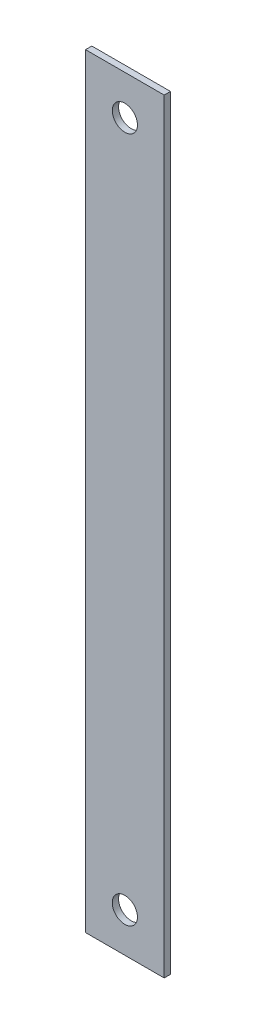
ISO-10303-21;
HEADER;
FILE_DESCRIPTION(('STEP AP214'),'2;1');
FILE_NAME('part.step','',(''),(''),'','','');
FILE_SCHEMA(('AUTOMOTIVE_DESIGN { 1 0 10303 214 1 1 1 1 }'));
ENDSEC;
DATA;
#1=APPLICATION_CONTEXT('core data for automotive mechanical design processes');
#2=APPLICATION_PROTOCOL_DEFINITION('international standard','automotive_design',2000,#1);
#3=PRODUCT_CONTEXT('',#1,'mechanical');
#4=PRODUCT('Part','Part','',(#3));
#5=PRODUCT_RELATED_PRODUCT_CATEGORY('part','',(#4));
#6=PRODUCT_DEFINITION_FORMATION('','',#4);
#7=PRODUCT_DEFINITION_CONTEXT('part definition',#1,'design');
#8=PRODUCT_DEFINITION('design','',#6,#7);
#9=PRODUCT_DEFINITION_SHAPE('','',#8);
#10=(LENGTH_UNIT() NAMED_UNIT(*) SI_UNIT(.MILLI.,.METRE.));
#11=(NAMED_UNIT(*) PLANE_ANGLE_UNIT() SI_UNIT($,.RADIAN.));
#12=(NAMED_UNIT(*) SI_UNIT($,.STERADIAN.) SOLID_ANGLE_UNIT());
#13=UNCERTAINTY_MEASURE_WITH_UNIT(LENGTH_MEASURE(1.E-05),#10,'distance_accuracy_value','');
#14=(GEOMETRIC_REPRESENTATION_CONTEXT(3) GLOBAL_UNCERTAINTY_ASSIGNED_CONTEXT((#13)) GLOBAL_UNIT_ASSIGNED_CONTEXT((#10,
#11,#12)) REPRESENTATION_CONTEXT('',''));
#15=CARTESIAN_POINT('',(0.,0.,0.));
#16=DIRECTION('',(0.,0.,1.));
#17=DIRECTION('',(1.,0.,0.));
#18=AXIS2_PLACEMENT_3D('',#15,#16,#17);
#19=CARTESIAN_POINT('',(0.,0.,2.));
#20=DIRECTION('',(0.,0.,1.));
#21=DIRECTION('',(1.,0.,0.));
#22=AXIS2_PLACEMENT_3D('',#19,#20,#21);
#23=PLANE('',#22);
#24=CARTESIAN_POINT('',(0.,109.,2.));
#25=DIRECTION('',(0.,0.,1.));
#26=DIRECTION('',(1.,0.,0.));
#27=AXIS2_PLACEMENT_3D('',#24,#25,#26);
#28=CIRCLE('',#27,4.);
#29=CARTESIAN_POINT('',(4.,109.,2.));
#30=VERTEX_POINT('',#29);
#31=EDGE_CURVE('E100',#30,#30,#28,.T.);
#32=ORIENTED_EDGE('',*,*,#31,.F.);
#33=EDGE_LOOP('',(#32));
#34=FACE_BOUND('',#33,.T.);
#35=DIRECTION('',(0.,1.,0.));
#36=VECTOR('',#35,1.);
#37=CARTESIAN_POINT('',(12.5,121.5,2.));
#38=LINE('',#37,#36);
#39=CARTESIAN_POINT('',(12.5,-121.5,2.));
#40=VERTEX_POINT('',#39);
#41=CARTESIAN_POINT('',(12.5,121.5,2.));
#42=VERTEX_POINT('',#41);
#43=EDGE_CURVE('E82',#40,#42,#38,.T.);
#44=ORIENTED_EDGE('',*,*,#43,.T.);
#45=DIRECTION('',(-1.,0.,0.));
#46=VECTOR('',#45,1.);
#47=CARTESIAN_POINT('',(3.5000000000001,121.5,2.));
#48=LINE('',#47,#46);
#49=CARTESIAN_POINT('',(-12.5,121.5,2.));
#50=VERTEX_POINT('',#49);
#51=EDGE_CURVE('E76',#42,#50,#48,.T.);
#52=ORIENTED_EDGE('',*,*,#51,.T.);
#53=DIRECTION('',(-1.64423508113657E-12,-1.,0.));
#54=VECTOR('',#53,1.);
#55=CARTESIAN_POINT('',(-12.5,121.482064426535,2.));
#56=LINE('',#55,#54);
#57=CARTESIAN_POINT('',(-12.5,-121.5,2.));
#58=VERTEX_POINT('',#57);
#59=EDGE_CURVE('E79',#50,#58,#56,.T.);
#60=ORIENTED_EDGE('',*,*,#59,.T.);
#61=DIRECTION('',(1.,0.,0.));
#62=VECTOR('',#61,1.);
#63=CARTESIAN_POINT('',(-12.5,-121.5,2.));
#64=LINE('',#63,#62);
#65=EDGE_CURVE('E49',#58,#40,#64,.T.);
#66=ORIENTED_EDGE('',*,*,#65,.T.);
#67=EDGE_LOOP('',(#44,#52,#60,#66));
#68=FACE_BOUND('',#67,.T.);
#69=CARTESIAN_POINT('',(0.,-109.,2.));
#70=DIRECTION('',(0.,0.,1.));
#71=DIRECTION('',(-1.,0.,0.));
#72=AXIS2_PLACEMENT_3D('',#69,#70,#71);
#73=CIRCLE('',#72,4.);
#74=CARTESIAN_POINT('',(-4.,-109.,2.));
#75=VERTEX_POINT('',#74);
#76=EDGE_CURVE('E112',#75,#75,#73,.T.);
#77=ORIENTED_EDGE('',*,*,#76,.F.);
#78=EDGE_LOOP('',(#77));
#79=FACE_BOUND('',#78,.T.);
#80=ADVANCED_FACE('F32',(#34,#68,#79),#23,.T.);
#81=CARTESIAN_POINT('',(0.,0.,0.));
#82=DIRECTION('',(0.,0.,1.));
#83=DIRECTION('',(1.,0.,0.));
#84=AXIS2_PLACEMENT_3D('',#81,#82,#83);
#85=PLANE('',#84);
#86=DIRECTION('',(0.,1.,0.));
#87=VECTOR('',#86,1.);
#88=CARTESIAN_POINT('',(12.5,121.5,0.));
#89=LINE('',#88,#87);
#90=CARTESIAN_POINT('',(12.5,-121.5,0.));
#91=VERTEX_POINT('',#90);
#92=CARTESIAN_POINT('',(12.5,121.5,0.));
#93=VERTEX_POINT('',#92);
#94=EDGE_CURVE('E97',#91,#93,#89,.T.);
#95=ORIENTED_EDGE('',*,*,#94,.F.);
#96=DIRECTION('',(1.,0.,0.));
#97=VECTOR('',#96,1.);
#98=CARTESIAN_POINT('',(3.50000000000013,-121.5,0.));
#99=LINE('',#98,#97);
#100=CARTESIAN_POINT('',(-12.5,-121.5,0.));
#101=VERTEX_POINT('',#100);
#102=EDGE_CURVE('E65',#101,#91,#99,.T.);
#103=ORIENTED_EDGE('',*,*,#102,.F.);
#104=DIRECTION('',(0.,-1.,0.));
#105=VECTOR('',#104,1.);
#106=CARTESIAN_POINT('',(-12.5,-115.487492177719,0.));
#107=LINE('',#106,#105);
#108=CARTESIAN_POINT('',(-12.5,121.5,0.));
#109=VERTEX_POINT('',#108);
#110=EDGE_CURVE('E102',#109,#101,#107,.T.);
#111=ORIENTED_EDGE('',*,*,#110,.F.);
#112=DIRECTION('',(-1.,0.,0.));
#113=VECTOR('',#112,1.);
#114=CARTESIAN_POINT('',(-12.5,121.5,0.));
#115=LINE('',#114,#113);
#116=EDGE_CURVE('E88',#93,#109,#115,.T.);
#117=ORIENTED_EDGE('',*,*,#116,.F.);
#118=EDGE_LOOP('',(#95,#103,#111,#117));
#119=FACE_BOUND('',#118,.T.);
#120=CARTESIAN_POINT('',(0.,109.,0.));
#121=DIRECTION('',(0.,0.,1.));
#122=DIRECTION('',(1.,0.,0.));
#123=AXIS2_PLACEMENT_3D('',#120,#121,#122);
#124=CIRCLE('',#123,4.);
#125=CARTESIAN_POINT('',(4.,109.,0.));
#126=VERTEX_POINT('',#125);
#127=EDGE_CURVE('E109',#126,#126,#124,.T.);
#128=ORIENTED_EDGE('',*,*,#127,.T.);
#129=EDGE_LOOP('',(#128));
#130=FACE_BOUND('',#129,.T.);
#131=CARTESIAN_POINT('',(0.,-109.,0.));
#132=DIRECTION('',(0.,0.,1.));
#133=DIRECTION('',(-1.,0.,0.));
#134=AXIS2_PLACEMENT_3D('',#131,#132,#133);
#135=CIRCLE('',#134,4.);
#136=CARTESIAN_POINT('',(-4.,-109.,0.));
#137=VERTEX_POINT('',#136);
#138=EDGE_CURVE('E115',#137,#137,#135,.T.);
#139=ORIENTED_EDGE('',*,*,#138,.T.);
#140=EDGE_LOOP('',(#139));
#141=FACE_BOUND('',#140,.T.);
#142=ADVANCED_FACE('F124',(#119,#130,#141),#85,.F.);
#143=CARTESIAN_POINT('',(12.5,121.5,2.));
#144=DIRECTION('',(-1.,0.,0.));
#145=DIRECTION('',(0.,0.,1.));
#146=AXIS2_PLACEMENT_3D('',#143,#144,#145);
#147=PLANE('',#146);
#148=ORIENTED_EDGE('',*,*,#94,.T.);
#149=DIRECTION('',(0.,0.,-1.));
#150=VECTOR('',#149,1.);
#151=CARTESIAN_POINT('',(12.5,121.5,2.));
#152=LINE('',#151,#150);
#153=EDGE_CURVE('E11',#42,#93,#152,.T.);
#154=ORIENTED_EDGE('',*,*,#153,.F.);
#155=ORIENTED_EDGE('',*,*,#43,.F.);
#156=DIRECTION('',(0.,0.,-1.));
#157=VECTOR('',#156,1.);
#158=CARTESIAN_POINT('',(12.5,-121.5,2.));
#159=LINE('',#158,#157);
#160=EDGE_CURVE('E93',#40,#91,#159,.T.);
#161=ORIENTED_EDGE('',*,*,#160,.T.);
#162=EDGE_LOOP('',(#148,#154,#155,#161));
#163=FACE_BOUND('',#162,.T.);
#164=ADVANCED_FACE('F34',(#163),#147,.F.);
#165=CARTESIAN_POINT('',(-12.5,121.5,2.));
#166=DIRECTION('',(0.,-1.,0.));
#167=DIRECTION('',(0.,0.,-1.));
#168=AXIS2_PLACEMENT_3D('',#165,#166,#167);
#169=PLANE('',#168);
#170=ORIENTED_EDGE('',*,*,#116,.T.);
#171=DIRECTION('',(0.,0.,-1.));
#172=VECTOR('',#171,1.);
#173=CARTESIAN_POINT('',(-12.5,121.5,2.));
#174=LINE('',#173,#172);
#175=EDGE_CURVE('E41',#50,#109,#174,.T.);
#176=ORIENTED_EDGE('',*,*,#175,.F.);
#177=ORIENTED_EDGE('',*,*,#51,.F.);
#178=ORIENTED_EDGE('',*,*,#153,.T.);
#179=EDGE_LOOP('',(#170,#176,#177,#178));
#180=FACE_BOUND('',#179,.T.);
#181=ADVANCED_FACE('F87',(#180),#169,.F.);
#182=CARTESIAN_POINT('',(-12.5,-115.487492177719,2.));
#183=DIRECTION('',(1.,0.,0.));
#184=DIRECTION('',(0.,0.,-1.));
#185=AXIS2_PLACEMENT_3D('',#182,#183,#184);
#186=PLANE('',#185);
#187=ORIENTED_EDGE('',*,*,#110,.T.);
#188=DIRECTION('',(0.,0.,-1.));
#189=VECTOR('',#188,1.);
#190=CARTESIAN_POINT('',(-12.5,-121.5,2.));
#191=LINE('',#190,#189);
#192=EDGE_CURVE('E90',#58,#101,#191,.T.);
#193=ORIENTED_EDGE('',*,*,#192,.F.);
#194=ORIENTED_EDGE('',*,*,#59,.F.);
#195=ORIENTED_EDGE('',*,*,#175,.T.);
#196=EDGE_LOOP('',(#187,#193,#194,#195));
#197=FACE_BOUND('',#196,.T.);
#198=ADVANCED_FACE('F91',(#197),#186,.F.);
#199=CARTESIAN_POINT('',(3.50000000000013,-121.5,2.));
#200=DIRECTION('',(0.,1.,0.));
#201=DIRECTION('',(0.,0.,1.));
#202=AXIS2_PLACEMENT_3D('',#199,#200,#201);
#203=PLANE('',#202);
#204=ORIENTED_EDGE('',*,*,#102,.T.);
#205=ORIENTED_EDGE('',*,*,#160,.F.);
#206=ORIENTED_EDGE('',*,*,#65,.F.);
#207=ORIENTED_EDGE('',*,*,#192,.T.);
#208=EDGE_LOOP('',(#204,#205,#206,#207));
#209=FACE_BOUND('',#208,.T.);
#210=ADVANCED_FACE('F106',(#209),#203,.F.);
#211=CARTESIAN_POINT('',(0.,109.,2.));
#212=DIRECTION('',(0.,0.,-1.));
#213=DIRECTION('',(-1.,0.,0.));
#214=AXIS2_PLACEMENT_3D('',#211,#212,#213);
#215=CYLINDRICAL_SURFACE('',#214,4.);
#216=ORIENTED_EDGE('',*,*,#31,.T.);
#217=EDGE_LOOP('',(#216));
#218=FACE_BOUND('',#217,.T.);
#219=ORIENTED_EDGE('',*,*,#127,.F.);
#220=EDGE_LOOP('',(#219));
#221=FACE_BOUND('',#220,.T.);
#222=ADVANCED_FACE('F133',(#218,#221),#215,.F.);
#223=CARTESIAN_POINT('',(0.,-109.,2.));
#224=DIRECTION('',(0.,0.,-1.));
#225=DIRECTION('',(-1.,0.,0.));
#226=AXIS2_PLACEMENT_3D('',#223,#224,#225);
#227=CYLINDRICAL_SURFACE('',#226,4.);
#228=ORIENTED_EDGE('',*,*,#76,.T.);
#229=EDGE_LOOP('',(#228));
#230=FACE_BOUND('',#229,.T.);
#231=ORIENTED_EDGE('',*,*,#138,.F.);
#232=EDGE_LOOP('',(#231));
#233=FACE_BOUND('',#232,.T.);
#234=ADVANCED_FACE('F121',(#230,#233),#227,.F.);
#235=CLOSED_SHELL('',(#80,#142,#164,#181,#198,#210,#222,#234));
#236=MANIFOLD_SOLID_BREP('B2',#235);
#237=ADVANCED_BREP_SHAPE_REPRESENTATION('',(#18,#236),#14);
#238=SHAPE_DEFINITION_REPRESENTATION(#9,#237);
ENDSEC;
END-ISO-10303-21;
